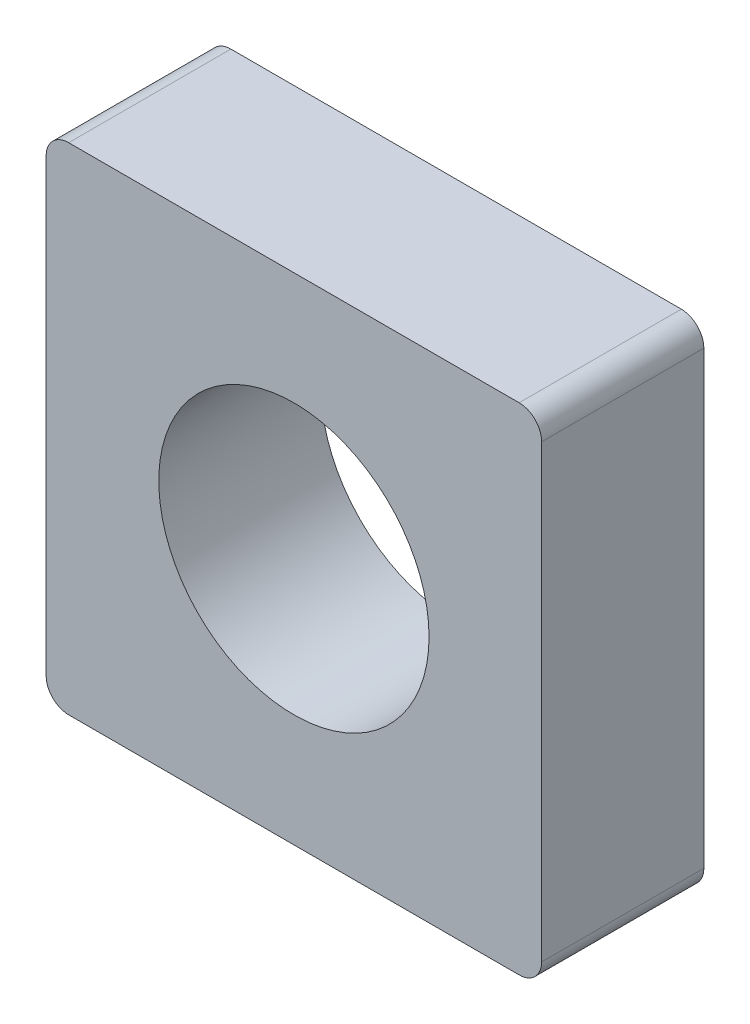
ISO-10303-21;
HEADER;
FILE_DESCRIPTION(('STEP AP214'),'2;1');
FILE_NAME('part.step','',(''),(''),'','','');
FILE_SCHEMA(('AUTOMOTIVE_DESIGN { 1 0 10303 214 1 1 1 1 }'));
ENDSEC;
DATA;
#1=APPLICATION_CONTEXT('core data for automotive mechanical design processes');
#2=APPLICATION_PROTOCOL_DEFINITION('international standard','automotive_design',2000,#1);
#3=PRODUCT_CONTEXT('',#1,'mechanical');
#4=PRODUCT('Part','Part','',(#3));
#5=PRODUCT_RELATED_PRODUCT_CATEGORY('part','',(#4));
#6=PRODUCT_DEFINITION_FORMATION('','',#4);
#7=PRODUCT_DEFINITION_CONTEXT('part definition',#1,'design');
#8=PRODUCT_DEFINITION('design','',#6,#7);
#9=PRODUCT_DEFINITION_SHAPE('','',#8);
#10=(LENGTH_UNIT() NAMED_UNIT(*) SI_UNIT(.MILLI.,.METRE.));
#11=(NAMED_UNIT(*) PLANE_ANGLE_UNIT() SI_UNIT($,.RADIAN.));
#12=(NAMED_UNIT(*) SI_UNIT($,.STERADIAN.) SOLID_ANGLE_UNIT());
#13=UNCERTAINTY_MEASURE_WITH_UNIT(LENGTH_MEASURE(1.E-05),#10,'distance_accuracy_value','');
#14=(GEOMETRIC_REPRESENTATION_CONTEXT(3) GLOBAL_UNCERTAINTY_ASSIGNED_CONTEXT((#13)) GLOBAL_UNIT_ASSIGNED_CONTEXT((#10,
#11,#12)) REPRESENTATION_CONTEXT('',''));
#15=CARTESIAN_POINT('',(0.,0.,0.));
#16=DIRECTION('',(0.,0.,1.));
#17=DIRECTION('',(1.,0.,0.));
#18=AXIS2_PLACEMENT_3D('',#15,#16,#17);
#19=CARTESIAN_POINT('',(0.25,0.25,1.8));
#20=DIRECTION('',(0.,0.,-1.));
#21=DIRECTION('',(-1.,0.,0.));
#22=AXIS2_PLACEMENT_3D('',#19,#20,#21);
#23=PLANE('',#22);
#24=CARTESIAN_POINT('',(0.25,0.25,1.8));
#25=DIRECTION('',(0.,0.,1.));
#26=DIRECTION('',(-1.,0.,0.));
#27=AXIS2_PLACEMENT_3D('',#24,#25,#26);
#28=CIRCLE('',#27,0.25);
#29=CARTESIAN_POINT('',(0.,0.250000000000002,1.8));
#30=VERTEX_POINT('',#29);
#31=CARTESIAN_POINT('',(0.250000000000002,0.,1.8));
#32=VERTEX_POINT('',#31);
#33=EDGE_CURVE('E144',#30,#32,#28,.T.);
#34=ORIENTED_EDGE('',*,*,#33,.T.);
#35=DIRECTION('',(1.,0.,0.));
#36=VECTOR('',#35,1.);
#37=CARTESIAN_POINT('',(0.250000000000002,0.,1.8));
#38=LINE('',#37,#36);
#39=CARTESIAN_POINT('',(5.25,0.,1.8));
#40=VERTEX_POINT('',#39);
#41=EDGE_CURVE('E92',#32,#40,#38,.T.);
#42=ORIENTED_EDGE('',*,*,#41,.T.);
#43=CARTESIAN_POINT('',(5.25,0.25,1.8));
#44=DIRECTION('',(0.,0.,1.));
#45=DIRECTION('',(1.,0.,0.));
#46=AXIS2_PLACEMENT_3D('',#43,#44,#45);
#47=CIRCLE('',#46,0.25);
#48=CARTESIAN_POINT('',(5.5,0.25,1.8));
#49=VERTEX_POINT('',#48);
#50=EDGE_CURVE('E159',#40,#49,#47,.T.);
#51=ORIENTED_EDGE('',*,*,#50,.T.);
#52=DIRECTION('',(0.,1.,0.));
#53=VECTOR('',#52,1.);
#54=CARTESIAN_POINT('',(5.5,0.250000000000002,1.8));
#55=LINE('',#54,#53);
#56=CARTESIAN_POINT('',(5.5,5.25,1.8));
#57=VERTEX_POINT('',#56);
#58=EDGE_CURVE('E172',#49,#57,#55,.T.);
#59=ORIENTED_EDGE('',*,*,#58,.T.);
#60=CARTESIAN_POINT('',(5.25,5.25,1.8));
#61=DIRECTION('',(0.,0.,1.));
#62=DIRECTION('',(-1.,0.,0.));
#63=AXIS2_PLACEMENT_3D('',#60,#61,#62);
#64=CIRCLE('',#63,0.25);
#65=CARTESIAN_POINT('',(5.25,5.5,1.8));
#66=VERTEX_POINT('',#65);
#67=EDGE_CURVE('E111',#57,#66,#64,.T.);
#68=ORIENTED_EDGE('',*,*,#67,.T.);
#69=DIRECTION('',(-1.,0.,0.));
#70=VECTOR('',#69,1.);
#71=CARTESIAN_POINT('',(0.250000000000002,5.5,1.8));
#72=LINE('',#71,#70);
#73=CARTESIAN_POINT('',(0.250000000000002,5.5,1.8));
#74=VERTEX_POINT('',#73);
#75=EDGE_CURVE('E105',#66,#74,#72,.T.);
#76=ORIENTED_EDGE('',*,*,#75,.T.);
#77=CARTESIAN_POINT('',(0.25,5.25,1.8));
#78=DIRECTION('',(0.,0.,1.));
#79=DIRECTION('',(-1.,0.,0.));
#80=AXIS2_PLACEMENT_3D('',#77,#78,#79);
#81=CIRCLE('',#80,0.25);
#82=CARTESIAN_POINT('',(0.,5.25,1.8));
#83=VERTEX_POINT('',#82);
#84=EDGE_CURVE('E109',#74,#83,#81,.T.);
#85=ORIENTED_EDGE('',*,*,#84,.T.);
#86=DIRECTION('',(0.,-1.,0.));
#87=VECTOR('',#86,1.);
#88=CARTESIAN_POINT('',(0.,0.250000000000002,1.8));
#89=LINE('',#88,#87);
#90=EDGE_CURVE('E49',#83,#30,#89,.T.);
#91=ORIENTED_EDGE('',*,*,#90,.T.);
#92=EDGE_LOOP('',(#34,#42,#51,#59,#68,#76,#85,#91));
#93=FACE_BOUND('',#92,.T.);
#94=CARTESIAN_POINT('',(2.75,2.75,1.8));
#95=DIRECTION('',(0.,0.,1.));
#96=DIRECTION('',(1.,0.,0.));
#97=AXIS2_PLACEMENT_3D('',#94,#95,#96);
#98=CIRCLE('',#97,1.5);
#99=CARTESIAN_POINT('',(4.25,2.75,1.8));
#100=VERTEX_POINT('',#99);
#101=EDGE_CURVE('E133',#100,#100,#98,.T.);
#102=ORIENTED_EDGE('',*,*,#101,.F.);
#103=EDGE_LOOP('',(#102));
#104=FACE_BOUND('',#103,.T.);
#105=ADVANCED_FACE('F32',(#93,#104),#23,.F.);
#106=CARTESIAN_POINT('',(0.25,0.25,0.));
#107=DIRECTION('',(0.,0.,-1.));
#108=DIRECTION('',(-1.,0.,0.));
#109=AXIS2_PLACEMENT_3D('',#106,#107,#108);
#110=PLANE('',#109);
#111=CARTESIAN_POINT('',(0.25,0.25,0.));
#112=DIRECTION('',(0.,0.,1.));
#113=DIRECTION('',(-1.,0.,0.));
#114=AXIS2_PLACEMENT_3D('',#111,#112,#113);
#115=CIRCLE('',#114,0.25);
#116=CARTESIAN_POINT('',(0.,0.250000000000002,0.));
#117=VERTEX_POINT('',#116);
#118=CARTESIAN_POINT('',(0.250000000000002,0.,0.));
#119=VERTEX_POINT('',#118);
#120=EDGE_CURVE('E129',#117,#119,#115,.T.);
#121=ORIENTED_EDGE('',*,*,#120,.F.);
#122=DIRECTION('',(0.,-1.,0.));
#123=VECTOR('',#122,1.);
#124=CARTESIAN_POINT('',(0.,0.250000000000002,0.));
#125=LINE('',#124,#123);
#126=CARTESIAN_POINT('',(0.,5.25,0.));
#127=VERTEX_POINT('',#126);
#128=EDGE_CURVE('E84',#127,#117,#125,.T.);
#129=ORIENTED_EDGE('',*,*,#128,.F.);
#130=CARTESIAN_POINT('',(0.25,5.25,0.));
#131=DIRECTION('',(0.,0.,1.));
#132=DIRECTION('',(-1.,0.,0.));
#133=AXIS2_PLACEMENT_3D('',#130,#131,#132);
#134=CIRCLE('',#133,0.25);
#135=CARTESIAN_POINT('',(0.250000000000002,5.5,0.));
#136=VERTEX_POINT('',#135);
#137=EDGE_CURVE('E78',#136,#127,#134,.T.);
#138=ORIENTED_EDGE('',*,*,#137,.F.);
#139=DIRECTION('',(-1.,0.,0.));
#140=VECTOR('',#139,1.);
#141=CARTESIAN_POINT('',(0.250000000000002,5.5,0.));
#142=LINE('',#141,#140);
#143=CARTESIAN_POINT('',(5.25,5.5,0.));
#144=VERTEX_POINT('',#143);
#145=EDGE_CURVE('E119',#144,#136,#142,.T.);
#146=ORIENTED_EDGE('',*,*,#145,.F.);
#147=CARTESIAN_POINT('',(5.25,5.25,0.));
#148=DIRECTION('',(0.,0.,1.));
#149=DIRECTION('',(-1.,0.,0.));
#150=AXIS2_PLACEMENT_3D('',#147,#148,#149);
#151=CIRCLE('',#150,0.25);
#152=CARTESIAN_POINT('',(5.5,5.25,0.));
#153=VERTEX_POINT('',#152);
#154=EDGE_CURVE('E139',#153,#144,#151,.T.);
#155=ORIENTED_EDGE('',*,*,#154,.F.);
#156=DIRECTION('',(0.,1.,0.));
#157=VECTOR('',#156,1.);
#158=CARTESIAN_POINT('',(5.5,0.250000000000002,0.));
#159=LINE('',#158,#157);
#160=CARTESIAN_POINT('',(5.5,0.25,0.));
#161=VERTEX_POINT('',#160);
#162=EDGE_CURVE('E137',#161,#153,#159,.T.);
#163=ORIENTED_EDGE('',*,*,#162,.F.);
#164=CARTESIAN_POINT('',(5.25,0.25,0.));
#165=DIRECTION('',(0.,0.,1.));
#166=DIRECTION('',(1.,0.,0.));
#167=AXIS2_PLACEMENT_3D('',#164,#165,#166);
#168=CIRCLE('',#167,0.25);
#169=CARTESIAN_POINT('',(5.25,0.,0.));
#170=VERTEX_POINT('',#169);
#171=EDGE_CURVE('E135',#170,#161,#168,.T.);
#172=ORIENTED_EDGE('',*,*,#171,.F.);
#173=DIRECTION('',(1.,0.,0.));
#174=VECTOR('',#173,1.);
#175=CARTESIAN_POINT('',(0.250000000000002,0.,0.));
#176=LINE('',#175,#174);
#177=EDGE_CURVE('E132',#119,#170,#176,.T.);
#178=ORIENTED_EDGE('',*,*,#177,.F.);
#179=EDGE_LOOP('',(#121,#129,#138,#146,#155,#163,#172,#178));
#180=FACE_BOUND('',#179,.T.);
#181=CARTESIAN_POINT('',(2.75,2.75,0.));
#182=DIRECTION('',(0.,0.,1.));
#183=DIRECTION('',(1.,0.,0.));
#184=AXIS2_PLACEMENT_3D('',#181,#182,#183);
#185=CIRCLE('',#184,1.5);
#186=CARTESIAN_POINT('',(4.25,2.75,0.));
#187=VERTEX_POINT('',#186);
#188=EDGE_CURVE('E178',#187,#187,#185,.T.);
#189=ORIENTED_EDGE('',*,*,#188,.T.);
#190=EDGE_LOOP('',(#189));
#191=FACE_BOUND('',#190,.T.);
#192=ADVANCED_FACE('F163',(#180,#191),#110,.T.);
#193=CARTESIAN_POINT('',(0.25,0.25,1.8));
#194=DIRECTION('',(0.,0.,-1.));
#195=DIRECTION('',(-1.,0.,0.));
#196=AXIS2_PLACEMENT_3D('',#193,#194,#195);
#197=CYLINDRICAL_SURFACE('',#196,0.25);
#198=ORIENTED_EDGE('',*,*,#120,.T.);
#199=DIRECTION('',(0.,0.,-1.));
#200=VECTOR('',#199,1.);
#201=CARTESIAN_POINT('',(0.250000000000002,0.,1.8));
#202=LINE('',#201,#200);
#203=EDGE_CURVE('E11',#32,#119,#202,.T.);
#204=ORIENTED_EDGE('',*,*,#203,.F.);
#205=ORIENTED_EDGE('',*,*,#33,.F.);
#206=DIRECTION('',(0.,0.,-1.));
#207=VECTOR('',#206,1.);
#208=CARTESIAN_POINT('',(0.,0.250000000000002,1.8));
#209=LINE('',#208,#207);
#210=EDGE_CURVE('E125',#30,#117,#209,.T.);
#211=ORIENTED_EDGE('',*,*,#210,.T.);
#212=EDGE_LOOP('',(#198,#204,#205,#211));
#213=FACE_BOUND('',#212,.T.);
#214=ADVANCED_FACE('F34',(#213),#197,.T.);
#215=CARTESIAN_POINT('',(0.250000000000002,0.,1.8));
#216=DIRECTION('',(0.,1.,0.));
#217=DIRECTION('',(0.,0.,1.));
#218=AXIS2_PLACEMENT_3D('',#215,#216,#217);
#219=PLANE('',#218);
#220=ORIENTED_EDGE('',*,*,#177,.T.);
#221=DIRECTION('',(0.,0.,-1.));
#222=VECTOR('',#221,1.);
#223=CARTESIAN_POINT('',(5.25,0.,1.8));
#224=LINE('',#223,#222);
#225=EDGE_CURVE('E41',#40,#170,#224,.T.);
#226=ORIENTED_EDGE('',*,*,#225,.F.);
#227=ORIENTED_EDGE('',*,*,#41,.F.);
#228=ORIENTED_EDGE('',*,*,#203,.T.);
#229=EDGE_LOOP('',(#220,#226,#227,#228));
#230=FACE_BOUND('',#229,.T.);
#231=ADVANCED_FACE('F206',(#230),#219,.F.);
#232=CARTESIAN_POINT('',(5.25,0.25,1.8));
#233=DIRECTION('',(0.,0.,-1.));
#234=DIRECTION('',(-1.,0.,0.));
#235=AXIS2_PLACEMENT_3D('',#232,#233,#234);
#236=CYLINDRICAL_SURFACE('',#235,0.25);
#237=ORIENTED_EDGE('',*,*,#171,.T.);
#238=DIRECTION('',(0.,0.,-1.));
#239=VECTOR('',#238,1.);
#240=CARTESIAN_POINT('',(5.5,0.25,1.8));
#241=LINE('',#240,#239);
#242=EDGE_CURVE('E151',#49,#161,#241,.T.);
#243=ORIENTED_EDGE('',*,*,#242,.F.);
#244=ORIENTED_EDGE('',*,*,#50,.F.);
#245=ORIENTED_EDGE('',*,*,#225,.T.);
#246=EDGE_LOOP('',(#237,#243,#244,#245));
#247=FACE_BOUND('',#246,.T.);
#248=ADVANCED_FACE('F157',(#247),#236,.T.);
#249=CARTESIAN_POINT('',(5.5,0.250000000000002,1.8));
#250=DIRECTION('',(-1.,0.,0.));
#251=DIRECTION('',(0.,0.,1.));
#252=AXIS2_PLACEMENT_3D('',#249,#250,#251);
#253=PLANE('',#252);
#254=ORIENTED_EDGE('',*,*,#162,.T.);
#255=DIRECTION('',(0.,0.,-1.));
#256=VECTOR('',#255,1.);
#257=CARTESIAN_POINT('',(5.5,5.25,1.8));
#258=LINE('',#257,#256);
#259=EDGE_CURVE('E148',#57,#153,#258,.T.);
#260=ORIENTED_EDGE('',*,*,#259,.F.);
#261=ORIENTED_EDGE('',*,*,#58,.F.);
#262=ORIENTED_EDGE('',*,*,#242,.T.);
#263=EDGE_LOOP('',(#254,#260,#261,#262));
#264=FACE_BOUND('',#263,.T.);
#265=ADVANCED_FACE('F168',(#264),#253,.F.);
#266=CARTESIAN_POINT('',(5.25,5.25,1.8));
#267=DIRECTION('',(0.,0.,-1.));
#268=DIRECTION('',(-1.,0.,0.));
#269=AXIS2_PLACEMENT_3D('',#266,#267,#268);
#270=CYLINDRICAL_SURFACE('',#269,0.25);
#271=ORIENTED_EDGE('',*,*,#154,.T.);
#272=DIRECTION('',(0.,0.,-1.));
#273=VECTOR('',#272,1.);
#274=CARTESIAN_POINT('',(5.25,5.5,1.8));
#275=LINE('',#274,#273);
#276=EDGE_CURVE('E120',#66,#144,#275,.T.);
#277=ORIENTED_EDGE('',*,*,#276,.F.);
#278=ORIENTED_EDGE('',*,*,#67,.F.);
#279=ORIENTED_EDGE('',*,*,#259,.T.);
#280=EDGE_LOOP('',(#271,#277,#278,#279));
#281=FACE_BOUND('',#280,.T.);
#282=ADVANCED_FACE('F171',(#281),#270,.T.);
#283=CARTESIAN_POINT('',(0.250000000000002,5.5,1.8));
#284=DIRECTION('',(0.,-1.,0.));
#285=DIRECTION('',(0.,0.,-1.));
#286=AXIS2_PLACEMENT_3D('',#283,#284,#285);
#287=PLANE('',#286);
#288=ORIENTED_EDGE('',*,*,#145,.T.);
#289=DIRECTION('',(0.,0.,-1.));
#290=VECTOR('',#289,1.);
#291=CARTESIAN_POINT('',(0.250000000000002,5.5,1.8));
#292=LINE('',#291,#290);
#293=EDGE_CURVE('E116',#74,#136,#292,.T.);
#294=ORIENTED_EDGE('',*,*,#293,.F.);
#295=ORIENTED_EDGE('',*,*,#75,.F.);
#296=ORIENTED_EDGE('',*,*,#276,.T.);
#297=EDGE_LOOP('',(#288,#294,#295,#296));
#298=FACE_BOUND('',#297,.T.);
#299=ADVANCED_FACE('F117',(#298),#287,.F.);
#300=CARTESIAN_POINT('',(0.25,5.25,1.8));
#301=DIRECTION('',(0.,0.,-1.));
#302=DIRECTION('',(-1.,0.,0.));
#303=AXIS2_PLACEMENT_3D('',#300,#301,#302);
#304=CYLINDRICAL_SURFACE('',#303,0.25);
#305=ORIENTED_EDGE('',*,*,#137,.T.);
#306=DIRECTION('',(0.,0.,-1.));
#307=VECTOR('',#306,1.);
#308=CARTESIAN_POINT('',(0.,5.25,1.8));
#309=LINE('',#308,#307);
#310=EDGE_CURVE('E121',#83,#127,#309,.T.);
#311=ORIENTED_EDGE('',*,*,#310,.F.);
#312=ORIENTED_EDGE('',*,*,#84,.F.);
#313=ORIENTED_EDGE('',*,*,#293,.T.);
#314=EDGE_LOOP('',(#305,#311,#312,#313));
#315=FACE_BOUND('',#314,.T.);
#316=ADVANCED_FACE('F123',(#315),#304,.T.);
#317=CARTESIAN_POINT('',(0.,0.250000000000002,1.8));
#318=DIRECTION('',(1.,0.,0.));
#319=DIRECTION('',(0.,0.,-1.));
#320=AXIS2_PLACEMENT_3D('',#317,#318,#319);
#321=PLANE('',#320);
#322=ORIENTED_EDGE('',*,*,#128,.T.);
#323=ORIENTED_EDGE('',*,*,#210,.F.);
#324=ORIENTED_EDGE('',*,*,#90,.F.);
#325=ORIENTED_EDGE('',*,*,#310,.T.);
#326=EDGE_LOOP('',(#322,#323,#324,#325));
#327=FACE_BOUND('',#326,.T.);
#328=ADVANCED_FACE('F194',(#327),#321,.F.);
#329=CARTESIAN_POINT('',(2.75,2.75,1.8));
#330=DIRECTION('',(0.,0.,-1.));
#331=DIRECTION('',(-1.,0.,0.));
#332=AXIS2_PLACEMENT_3D('',#329,#330,#331);
#333=CYLINDRICAL_SURFACE('',#332,1.5);
#334=ORIENTED_EDGE('',*,*,#101,.T.);
#335=EDGE_LOOP('',(#334));
#336=FACE_BOUND('',#335,.T.);
#337=ORIENTED_EDGE('',*,*,#188,.F.);
#338=EDGE_LOOP('',(#337));
#339=FACE_BOUND('',#338,.T.);
#340=ADVANCED_FACE('F184',(#336,#339),#333,.F.);
#341=CLOSED_SHELL('',(#105,#192,#214,#231,#248,#265,#282,#299,#316,#328,#340));
#342=MANIFOLD_SOLID_BREP('B2',#341);
#343=ADVANCED_BREP_SHAPE_REPRESENTATION('',(#18,#342),#14);
#344=SHAPE_DEFINITION_REPRESENTATION(#9,#343);
ENDSEC;
END-ISO-10303-21;
